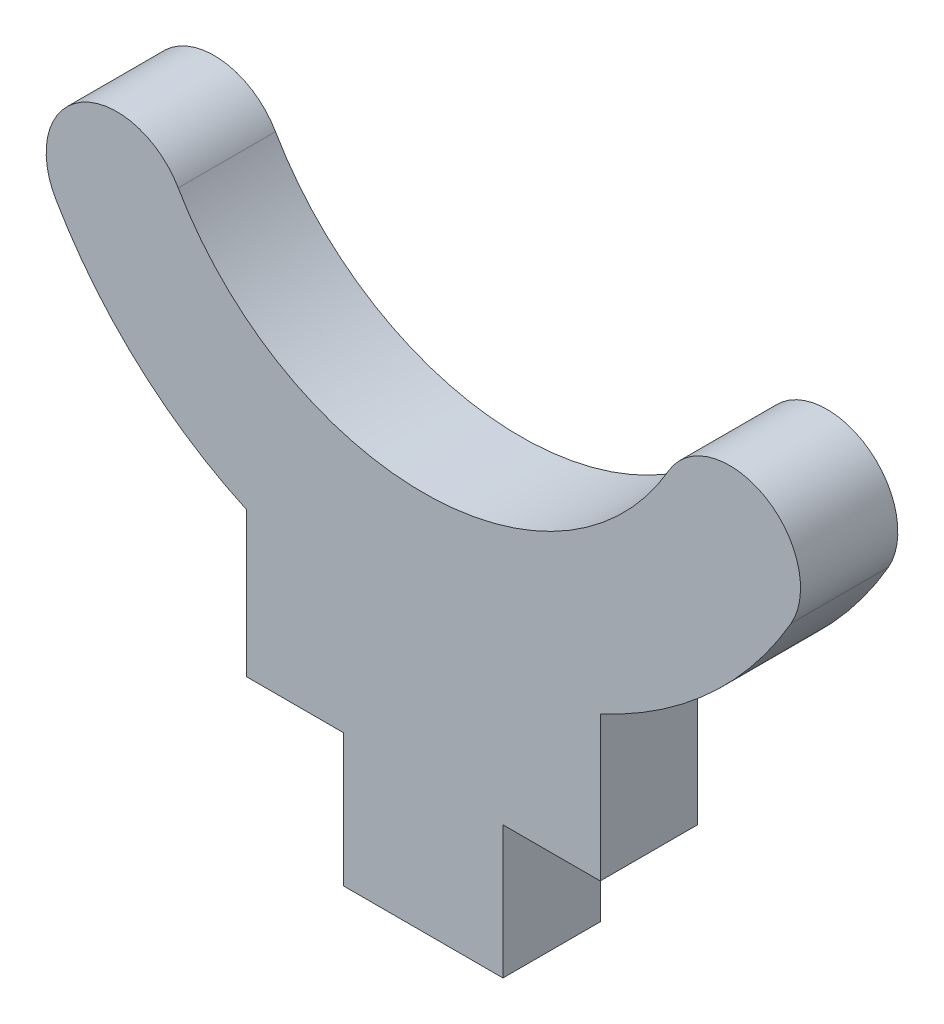
ISO-10303-21;
HEADER;
FILE_DESCRIPTION(('STEP AP214'),'2;1');
FILE_NAME('part.step','',(''),(''),'','','');
FILE_SCHEMA(('AUTOMOTIVE_DESIGN { 1 0 10303 214 1 1 1 1 }'));
ENDSEC;
DATA;
#1=APPLICATION_CONTEXT('core data for automotive mechanical design processes');
#2=APPLICATION_PROTOCOL_DEFINITION('international standard','automotive_design',2000,#1);
#3=PRODUCT_CONTEXT('',#1,'mechanical');
#4=PRODUCT('Part','Part','',(#3));
#5=PRODUCT_RELATED_PRODUCT_CATEGORY('part','',(#4));
#6=PRODUCT_DEFINITION_FORMATION('','',#4);
#7=PRODUCT_DEFINITION_CONTEXT('part definition',#1,'design');
#8=PRODUCT_DEFINITION('design','',#6,#7);
#9=PRODUCT_DEFINITION_SHAPE('','',#8);
#10=(LENGTH_UNIT() NAMED_UNIT(*) SI_UNIT(.MILLI.,.METRE.));
#11=(NAMED_UNIT(*) PLANE_ANGLE_UNIT() SI_UNIT($,.RADIAN.));
#12=(NAMED_UNIT(*) SI_UNIT($,.STERADIAN.) SOLID_ANGLE_UNIT());
#13=UNCERTAINTY_MEASURE_WITH_UNIT(LENGTH_MEASURE(1.E-05),#10,'distance_accuracy_value','');
#14=(GEOMETRIC_REPRESENTATION_CONTEXT(3) GLOBAL_UNCERTAINTY_ASSIGNED_CONTEXT((#13)) GLOBAL_UNIT_ASSIGNED_CONTEXT((#10,
#11,#12)) REPRESENTATION_CONTEXT('',''));
#15=CARTESIAN_POINT('',(0.,0.,0.));
#16=DIRECTION('',(0.,0.,1.));
#17=DIRECTION('',(1.,0.,0.));
#18=AXIS2_PLACEMENT_3D('',#15,#16,#17);
#19=CARTESIAN_POINT('',(-17.3205080756888,27.5,5.5));
#20=DIRECTION('',(0.,0.,-1.));
#21=DIRECTION('',(-1.,0.,0.));
#22=AXIS2_PLACEMENT_3D('',#19,#20,#21);
#23=CYLINDRICAL_SURFACE('',#22,4.);
#24=CARTESIAN_POINT('',(-17.3205080756888,27.5,0.));
#25=DIRECTION('',(0.,0.,1.));
#26=DIRECTION('',(-1.,0.,0.));
#27=AXIS2_PLACEMENT_3D('',#24,#25,#26);
#28=CIRCLE('',#27,4.);
#29=CARTESIAN_POINT('',(-13.856406460551,29.5,0.));
#30=VERTEX_POINT('',#29);
#31=CARTESIAN_POINT('',(-20.7846096908266,25.5,0.));
#32=VERTEX_POINT('',#31);
#33=EDGE_CURVE('E181',#30,#32,#28,.T.);
#34=ORIENTED_EDGE('',*,*,#33,.T.);
#35=DIRECTION('',(0.,0.,-1.));
#36=VECTOR('',#35,1.);
#37=CARTESIAN_POINT('',(-20.7846096908266,25.5,5.5));
#38=LINE('',#37,#36);
#39=CARTESIAN_POINT('',(-20.7846096908266,25.5,5.5));
#40=VERTEX_POINT('',#39);
#41=EDGE_CURVE('E11',#40,#32,#38,.T.);
#42=ORIENTED_EDGE('',*,*,#41,.F.);
#43=CARTESIAN_POINT('',(-17.3205080756888,27.5,5.5));
#44=DIRECTION('',(0.,0.,1.));
#45=DIRECTION('',(-1.,0.,0.));
#46=AXIS2_PLACEMENT_3D('',#43,#44,#45);
#47=CIRCLE('',#46,4.);
#48=CARTESIAN_POINT('',(-13.856406460551,29.5,5.5));
#49=VERTEX_POINT('',#48);
#50=EDGE_CURVE('E155',#49,#40,#47,.T.);
#51=ORIENTED_EDGE('',*,*,#50,.F.);
#52=DIRECTION('',(0.,0.,-1.));
#53=VECTOR('',#52,1.);
#54=CARTESIAN_POINT('',(-13.856406460551,29.5,5.5));
#55=LINE('',#54,#53);
#56=EDGE_CURVE('E156',#49,#30,#55,.T.);
#57=ORIENTED_EDGE('',*,*,#56,.T.);
#58=EDGE_LOOP('',(#34,#42,#51,#57));
#59=FACE_BOUND('',#58,.T.);
#60=ADVANCED_FACE('F33',(#59),#23,.T.);
#61=CARTESIAN_POINT('',(0.,37.5,5.5));
#62=DIRECTION('',(0.,0.,-1.));
#63=DIRECTION('',(-1.,0.,0.));
#64=AXIS2_PLACEMENT_3D('',#61,#62,#63);
#65=CYLINDRICAL_SURFACE('',#64,24.);
#66=CARTESIAN_POINT('',(0.,37.5,0.));
#67=DIRECTION('',(0.,0.,1.));
#68=DIRECTION('',(-1.,0.,0.));
#69=AXIS2_PLACEMENT_3D('',#66,#67,#68);
#70=CIRCLE('',#69,24.);
#71=CARTESIAN_POINT('',(-10.,15.6825757707286,0.));
#72=VERTEX_POINT('',#71);
#73=EDGE_CURVE('E179',#32,#72,#70,.T.);
#74=ORIENTED_EDGE('',*,*,#73,.T.);
#75=DIRECTION('',(0.,0.,-1.));
#76=VECTOR('',#75,1.);
#77=CARTESIAN_POINT('',(-10.,15.6825757707286,5.5));
#78=LINE('',#77,#76);
#79=CARTESIAN_POINT('',(-10.,15.6825757707286,5.5));
#80=VERTEX_POINT('',#79);
#81=EDGE_CURVE('E40',#80,#72,#78,.T.);
#82=ORIENTED_EDGE('',*,*,#81,.F.);
#83=CARTESIAN_POINT('',(0.,37.5,5.5));
#84=DIRECTION('',(0.,0.,1.));
#85=DIRECTION('',(-1.,0.,0.));
#86=AXIS2_PLACEMENT_3D('',#83,#84,#85);
#87=CIRCLE('',#86,24.);
#88=EDGE_CURVE('E197',#40,#80,#87,.T.);
#89=ORIENTED_EDGE('',*,*,#88,.F.);
#90=ORIENTED_EDGE('',*,*,#41,.T.);
#91=EDGE_LOOP('',(#74,#82,#89,#90));
#92=FACE_BOUND('',#91,.T.);
#93=ADVANCED_FACE('F245',(#92),#65,.T.);
#94=CARTESIAN_POINT('',(-10.,15.6825757707286,5.5));
#95=DIRECTION('',(1.,0.,0.));
#96=DIRECTION('',(0.,1.,0.));
#97=AXIS2_PLACEMENT_3D('',#94,#95,#96);
#98=PLANE('',#97);
#99=DIRECTION('',(0.,-1.,0.));
#100=VECTOR('',#99,1.);
#101=CARTESIAN_POINT('',(-10.,15.6825757707286,0.));
#102=LINE('',#101,#100);
#103=CARTESIAN_POINT('',(-10.,7.5,0.));
#104=VERTEX_POINT('',#103);
#105=EDGE_CURVE('E148',#72,#104,#102,.T.);
#106=ORIENTED_EDGE('',*,*,#105,.T.);
#107=DIRECTION('',(0.,0.,1.));
#108=VECTOR('',#107,1.);
#109=CARTESIAN_POINT('',(-10.,7.5,0.));
#110=LINE('',#109,#108);
#111=CARTESIAN_POINT('',(-10.,7.5,5.5));
#112=VERTEX_POINT('',#111);
#113=EDGE_CURVE('E205',#104,#112,#110,.T.);
#114=ORIENTED_EDGE('',*,*,#113,.T.);
#115=DIRECTION('',(0.,-1.,0.));
#116=VECTOR('',#115,1.);
#117=CARTESIAN_POINT('',(-10.,15.6825757707286,5.5));
#118=LINE('',#117,#116);
#119=EDGE_CURVE('E176',#80,#112,#118,.T.);
#120=ORIENTED_EDGE('',*,*,#119,.F.);
#121=ORIENTED_EDGE('',*,*,#81,.T.);
#122=EDGE_LOOP('',(#106,#114,#120,#121));
#123=FACE_BOUND('',#122,.T.);
#124=ADVANCED_FACE('F173',(#123),#98,.F.);
#125=CARTESIAN_POINT('',(-10.,0.,5.5));
#126=DIRECTION('',(0.,1.,0.));
#127=DIRECTION('',(0.,0.,1.));
#128=AXIS2_PLACEMENT_3D('',#125,#126,#127);
#129=PLANE('',#128);
#130=DIRECTION('',(1.,0.,0.));
#131=VECTOR('',#130,1.);
#132=CARTESIAN_POINT('',(-10.,0.,0.));
#133=LINE('',#132,#131);
#134=CARTESIAN_POINT('',(-4.5,0.,0.));
#135=VERTEX_POINT('',#134);
#136=CARTESIAN_POINT('',(4.5,0.,0.));
#137=VERTEX_POINT('',#136);
#138=EDGE_CURVE('E143',#135,#137,#133,.T.);
#139=ORIENTED_EDGE('',*,*,#138,.T.);
#140=DIRECTION('',(0.,0.,1.));
#141=VECTOR('',#140,1.);
#142=CARTESIAN_POINT('',(4.5,0.,0.));
#143=LINE('',#142,#141);
#144=CARTESIAN_POINT('',(4.5,0.,5.5));
#145=VERTEX_POINT('',#144);
#146=EDGE_CURVE('E186',#137,#145,#143,.T.);
#147=ORIENTED_EDGE('',*,*,#146,.T.);
#148=DIRECTION('',(1.,0.,0.));
#149=VECTOR('',#148,1.);
#150=CARTESIAN_POINT('',(-10.,0.,5.5));
#151=LINE('',#150,#149);
#152=CARTESIAN_POINT('',(-4.5,0.,5.5));
#153=VERTEX_POINT('',#152);
#154=EDGE_CURVE('E193',#153,#145,#151,.T.);
#155=ORIENTED_EDGE('',*,*,#154,.F.);
#156=DIRECTION('',(0.,0.,1.));
#157=VECTOR('',#156,1.);
#158=CARTESIAN_POINT('',(-4.5,0.,0.));
#159=LINE('',#158,#157);
#160=EDGE_CURVE('E201',#135,#153,#159,.T.);
#161=ORIENTED_EDGE('',*,*,#160,.F.);
#162=EDGE_LOOP('',(#139,#147,#155,#161));
#163=FACE_BOUND('',#162,.T.);
#164=ADVANCED_FACE('F224',(#163),#129,.F.);
#165=CARTESIAN_POINT('',(10.,0.,5.5));
#166=DIRECTION('',(-1.,0.,0.));
#167=DIRECTION('',(0.,-1.,0.));
#168=AXIS2_PLACEMENT_3D('',#165,#166,#167);
#169=PLANE('',#168);
#170=DIRECTION('',(0.,1.,0.));
#171=VECTOR('',#170,1.);
#172=CARTESIAN_POINT('',(10.,0.,5.5));
#173=LINE('',#172,#171);
#174=CARTESIAN_POINT('',(10.,7.5,5.5));
#175=VERTEX_POINT('',#174);
#176=CARTESIAN_POINT('',(10.,15.6825757707286,5.5));
#177=VERTEX_POINT('',#176);
#178=EDGE_CURVE('E137',#175,#177,#173,.T.);
#179=ORIENTED_EDGE('',*,*,#178,.F.);
#180=DIRECTION('',(0.,0.,1.));
#181=VECTOR('',#180,1.);
#182=CARTESIAN_POINT('',(10.,7.5,0.));
#183=LINE('',#182,#181);
#184=CARTESIAN_POINT('',(10.,7.5,0.));
#185=VERTEX_POINT('',#184);
#186=EDGE_CURVE('E124',#185,#175,#183,.T.);
#187=ORIENTED_EDGE('',*,*,#186,.F.);
#188=DIRECTION('',(0.,1.,0.));
#189=VECTOR('',#188,1.);
#190=CARTESIAN_POINT('',(10.,0.,0.));
#191=LINE('',#190,#189);
#192=CARTESIAN_POINT('',(10.,15.6825757707286,0.));
#193=VERTEX_POINT('',#192);
#194=EDGE_CURVE('E135',#185,#193,#191,.T.);
#195=ORIENTED_EDGE('',*,*,#194,.T.);
#196=DIRECTION('',(0.,0.,-1.));
#197=VECTOR('',#196,1.);
#198=CARTESIAN_POINT('',(10.,15.6825757707286,5.5));
#199=LINE('',#198,#197);
#200=EDGE_CURVE('E166',#177,#193,#199,.T.);
#201=ORIENTED_EDGE('',*,*,#200,.F.);
#202=EDGE_LOOP('',(#179,#187,#195,#201));
#203=FACE_BOUND('',#202,.T.);
#204=ADVANCED_FACE('F133',(#203),#169,.F.);
#205=CARTESIAN_POINT('',(0.,37.5,5.5));
#206=DIRECTION('',(0.,0.,-1.));
#207=DIRECTION('',(-1.,0.,0.));
#208=AXIS2_PLACEMENT_3D('',#205,#206,#207);
#209=CYLINDRICAL_SURFACE('',#208,24.);
#210=CARTESIAN_POINT('',(0.,37.5,0.));
#211=DIRECTION('',(0.,0.,1.));
#212=DIRECTION('',(-1.,0.,0.));
#213=AXIS2_PLACEMENT_3D('',#210,#211,#212);
#214=CIRCLE('',#213,24.);
#215=CARTESIAN_POINT('',(20.7846096908266,25.5000000000001,0.));
#216=VERTEX_POINT('',#215);
#217=EDGE_CURVE('E142',#193,#216,#214,.T.);
#218=ORIENTED_EDGE('',*,*,#217,.T.);
#219=DIRECTION('',(0.,0.,-1.));
#220=VECTOR('',#219,1.);
#221=CARTESIAN_POINT('',(20.7846096908266,25.5000000000001,5.5));
#222=LINE('',#221,#220);
#223=CARTESIAN_POINT('',(20.7846096908266,25.5000000000001,5.5));
#224=VERTEX_POINT('',#223);
#225=EDGE_CURVE('E163',#224,#216,#222,.T.);
#226=ORIENTED_EDGE('',*,*,#225,.F.);
#227=CARTESIAN_POINT('',(0.,37.5,5.5));
#228=DIRECTION('',(0.,0.,1.));
#229=DIRECTION('',(-1.,0.,0.));
#230=AXIS2_PLACEMENT_3D('',#227,#228,#229);
#231=CIRCLE('',#230,24.);
#232=EDGE_CURVE('E190',#177,#224,#231,.T.);
#233=ORIENTED_EDGE('',*,*,#232,.F.);
#234=ORIENTED_EDGE('',*,*,#200,.T.);
#235=EDGE_LOOP('',(#218,#226,#233,#234));
#236=FACE_BOUND('',#235,.T.);
#237=ADVANCED_FACE('F264',(#236),#209,.T.);
#238=CARTESIAN_POINT('',(17.3205080756888,27.5,5.5));
#239=DIRECTION('',(0.,0.,-1.));
#240=DIRECTION('',(-1.,0.,0.));
#241=AXIS2_PLACEMENT_3D('',#238,#239,#240);
#242=CYLINDRICAL_SURFACE('',#241,4.);
#243=CARTESIAN_POINT('',(17.3205080756888,27.5,0.));
#244=DIRECTION('',(0.,0.,1.));
#245=DIRECTION('',(-1.,0.,0.));
#246=AXIS2_PLACEMENT_3D('',#243,#244,#245);
#247=CIRCLE('',#246,4.);
#248=CARTESIAN_POINT('',(13.856406460551,29.5,0.));
#249=VERTEX_POINT('',#248);
#250=EDGE_CURVE('E145',#216,#249,#247,.T.);
#251=ORIENTED_EDGE('',*,*,#250,.T.);
#252=DIRECTION('',(0.,0.,-1.));
#253=VECTOR('',#252,1.);
#254=CARTESIAN_POINT('',(13.856406460551,29.5,5.5));
#255=LINE('',#254,#253);
#256=CARTESIAN_POINT('',(13.856406460551,29.5,5.5));
#257=VERTEX_POINT('',#256);
#258=EDGE_CURVE('E159',#257,#249,#255,.T.);
#259=ORIENTED_EDGE('',*,*,#258,.F.);
#260=CARTESIAN_POINT('',(17.3205080756888,27.5,5.5));
#261=DIRECTION('',(0.,0.,1.));
#262=DIRECTION('',(-1.,0.,0.));
#263=AXIS2_PLACEMENT_3D('',#260,#261,#262);
#264=CIRCLE('',#263,4.);
#265=EDGE_CURVE('E188',#224,#257,#264,.T.);
#266=ORIENTED_EDGE('',*,*,#265,.F.);
#267=ORIENTED_EDGE('',*,*,#225,.T.);
#268=EDGE_LOOP('',(#251,#259,#266,#267));
#269=FACE_BOUND('',#268,.T.);
#270=ADVANCED_FACE('F260',(#269),#242,.T.);
#271=CARTESIAN_POINT('',(0.,37.5,5.5));
#272=DIRECTION('',(0.,0.,-1.));
#273=DIRECTION('',(-1.,0.,0.));
#274=AXIS2_PLACEMENT_3D('',#271,#272,#273);
#275=CYLINDRICAL_SURFACE('',#274,16.);
#276=CARTESIAN_POINT('',(0.,37.5,0.));
#277=DIRECTION('',(0.,0.,-1.));
#278=DIRECTION('',(1.,0.,0.));
#279=AXIS2_PLACEMENT_3D('',#276,#277,#278);
#280=CIRCLE('',#279,16.);
#281=EDGE_CURVE('E153',#249,#30,#280,.T.);
#282=ORIENTED_EDGE('',*,*,#281,.T.);
#283=ORIENTED_EDGE('',*,*,#56,.F.);
#284=CARTESIAN_POINT('',(0.,37.5,5.5));
#285=DIRECTION('',(0.,0.,-1.));
#286=DIRECTION('',(1.,0.,0.));
#287=AXIS2_PLACEMENT_3D('',#284,#285,#286);
#288=CIRCLE('',#287,16.);
#289=EDGE_CURVE('E160',#257,#49,#288,.T.);
#290=ORIENTED_EDGE('',*,*,#289,.F.);
#291=ORIENTED_EDGE('',*,*,#258,.T.);
#292=EDGE_LOOP('',(#282,#283,#290,#291));
#293=FACE_BOUND('',#292,.T.);
#294=ADVANCED_FACE('F255',(#293),#275,.F.);
#295=CARTESIAN_POINT('',(-17.3205080756888,27.5,5.5));
#296=DIRECTION('',(0.,0.,-1.));
#297=DIRECTION('',(-1.,0.,0.));
#298=AXIS2_PLACEMENT_3D('',#295,#296,#297);
#299=PLANE('',#298);
#300=ORIENTED_EDGE('',*,*,#154,.T.);
#301=DIRECTION('',(0.,-1.,0.));
#302=VECTOR('',#301,1.);
#303=CARTESIAN_POINT('',(4.5,0.,5.5));
#304=LINE('',#303,#302);
#305=CARTESIAN_POINT('',(4.5,7.5,5.5));
#306=VERTEX_POINT('',#305);
#307=EDGE_CURVE('E129',#306,#145,#304,.T.);
#308=ORIENTED_EDGE('',*,*,#307,.F.);
#309=DIRECTION('',(-1.,0.,0.));
#310=VECTOR('',#309,1.);
#311=CARTESIAN_POINT('',(10.,7.5,5.5));
#312=LINE('',#311,#310);
#313=EDGE_CURVE('E207',#175,#306,#312,.T.);
#314=ORIENTED_EDGE('',*,*,#313,.F.);
#315=ORIENTED_EDGE('',*,*,#178,.T.);
#316=ORIENTED_EDGE('',*,*,#232,.T.);
#317=ORIENTED_EDGE('',*,*,#265,.T.);
#318=ORIENTED_EDGE('',*,*,#289,.T.);
#319=ORIENTED_EDGE('',*,*,#50,.T.);
#320=ORIENTED_EDGE('',*,*,#88,.T.);
#321=ORIENTED_EDGE('',*,*,#119,.T.);
#322=DIRECTION('',(-1.,0.,0.));
#323=VECTOR('',#322,1.);
#324=CARTESIAN_POINT('',(-10.,7.5,5.5));
#325=LINE('',#324,#323);
#326=CARTESIAN_POINT('',(-4.5,7.5,5.5));
#327=VERTEX_POINT('',#326);
#328=EDGE_CURVE('E208',#327,#112,#325,.T.);
#329=ORIENTED_EDGE('',*,*,#328,.F.);
#330=DIRECTION('',(0.,1.,0.));
#331=VECTOR('',#330,1.);
#332=CARTESIAN_POINT('',(-4.5,0.,5.5));
#333=LINE('',#332,#331);
#334=EDGE_CURVE('E211',#153,#327,#333,.T.);
#335=ORIENTED_EDGE('',*,*,#334,.F.);
#336=EDGE_LOOP('',(#300,#308,#314,#315,#316,#317,#318,#319,#320,#321,#329,#335));
#337=FACE_BOUND('',#336,.T.);
#338=ADVANCED_FACE('F231',(#337),#299,.F.);
#339=CARTESIAN_POINT('',(-17.3205080756888,27.5,0.));
#340=DIRECTION('',(0.,0.,-1.));
#341=DIRECTION('',(-1.,0.,0.));
#342=AXIS2_PLACEMENT_3D('',#339,#340,#341);
#343=PLANE('',#342);
#344=DIRECTION('',(0.,-1.,0.));
#345=VECTOR('',#344,1.);
#346=CARTESIAN_POINT('',(4.5,0.,0.));
#347=LINE('',#346,#345);
#348=CARTESIAN_POINT('',(4.5,7.5,0.));
#349=VERTEX_POINT('',#348);
#350=EDGE_CURVE('E47',#349,#137,#347,.T.);
#351=ORIENTED_EDGE('',*,*,#350,.T.);
#352=ORIENTED_EDGE('',*,*,#138,.F.);
#353=DIRECTION('',(0.,1.,0.));
#354=VECTOR('',#353,1.);
#355=CARTESIAN_POINT('',(-4.5,0.,0.));
#356=LINE('',#355,#354);
#357=CARTESIAN_POINT('',(-4.5,7.5,0.));
#358=VERTEX_POINT('',#357);
#359=EDGE_CURVE('E210',#135,#358,#356,.T.);
#360=ORIENTED_EDGE('',*,*,#359,.T.);
#361=DIRECTION('',(-1.,0.,0.));
#362=VECTOR('',#361,1.);
#363=CARTESIAN_POINT('',(-10.,7.5,0.));
#364=LINE('',#363,#362);
#365=EDGE_CURVE('E55',#358,#104,#364,.T.);
#366=ORIENTED_EDGE('',*,*,#365,.T.);
#367=ORIENTED_EDGE('',*,*,#105,.F.);
#368=ORIENTED_EDGE('',*,*,#73,.F.);
#369=ORIENTED_EDGE('',*,*,#33,.F.);
#370=ORIENTED_EDGE('',*,*,#281,.F.);
#371=ORIENTED_EDGE('',*,*,#250,.F.);
#372=ORIENTED_EDGE('',*,*,#217,.F.);
#373=ORIENTED_EDGE('',*,*,#194,.F.);
#374=DIRECTION('',(-1.,0.,0.));
#375=VECTOR('',#374,1.);
#376=CARTESIAN_POINT('',(10.,7.5,0.));
#377=LINE('',#376,#375);
#378=EDGE_CURVE('E120',#185,#349,#377,.T.);
#379=ORIENTED_EDGE('',*,*,#378,.T.);
#380=EDGE_LOOP('',(#351,#352,#360,#366,#367,#368,#369,#370,#371,#372,#373,#379));
#381=FACE_BOUND('',#380,.T.);
#382=ADVANCED_FACE('F140',(#381),#343,.T.);
#383=CARTESIAN_POINT('',(-10.,7.5,0.));
#384=DIRECTION('',(0.,1.,0.));
#385=DIRECTION('',(0.,0.,1.));
#386=AXIS2_PLACEMENT_3D('',#383,#384,#385);
#387=PLANE('',#386);
#388=ORIENTED_EDGE('',*,*,#328,.T.);
#389=ORIENTED_EDGE('',*,*,#113,.F.);
#390=ORIENTED_EDGE('',*,*,#365,.F.);
#391=DIRECTION('',(0.,0.,1.));
#392=VECTOR('',#391,1.);
#393=CARTESIAN_POINT('',(-4.5,7.5,0.));
#394=LINE('',#393,#392);
#395=EDGE_CURVE('E203',#358,#327,#394,.T.);
#396=ORIENTED_EDGE('',*,*,#395,.T.);
#397=EDGE_LOOP('',(#388,#389,#390,#396));
#398=FACE_BOUND('',#397,.T.);
#399=ADVANCED_FACE('F233',(#398),#387,.F.);
#400=CARTESIAN_POINT('',(-4.5,0.,0.));
#401=DIRECTION('',(1.,0.,0.));
#402=DIRECTION('',(0.,0.,-1.));
#403=AXIS2_PLACEMENT_3D('',#400,#401,#402);
#404=PLANE('',#403);
#405=ORIENTED_EDGE('',*,*,#334,.T.);
#406=ORIENTED_EDGE('',*,*,#395,.F.);
#407=ORIENTED_EDGE('',*,*,#359,.F.);
#408=ORIENTED_EDGE('',*,*,#160,.T.);
#409=EDGE_LOOP('',(#405,#406,#407,#408));
#410=FACE_BOUND('',#409,.T.);
#411=ADVANCED_FACE('F228',(#410),#404,.F.);
#412=CARTESIAN_POINT('',(4.5,0.,0.));
#413=DIRECTION('',(-1.,0.,0.));
#414=DIRECTION('',(0.,0.,1.));
#415=AXIS2_PLACEMENT_3D('',#412,#413,#414);
#416=PLANE('',#415);
#417=ORIENTED_EDGE('',*,*,#307,.T.);
#418=ORIENTED_EDGE('',*,*,#146,.F.);
#419=ORIENTED_EDGE('',*,*,#350,.F.);
#420=DIRECTION('',(0.,0.,1.));
#421=VECTOR('',#420,1.);
#422=CARTESIAN_POINT('',(4.5,7.5,0.));
#423=LINE('',#422,#421);
#424=EDGE_CURVE('E126',#349,#306,#423,.T.);
#425=ORIENTED_EDGE('',*,*,#424,.T.);
#426=EDGE_LOOP('',(#417,#418,#419,#425));
#427=FACE_BOUND('',#426,.T.);
#428=ADVANCED_FACE('F240',(#427),#416,.F.);
#429=CARTESIAN_POINT('',(10.,7.5,0.));
#430=DIRECTION('',(0.,1.,0.));
#431=DIRECTION('',(-1.,0.,0.));
#432=AXIS2_PLACEMENT_3D('',#429,#430,#431);
#433=PLANE('',#432);
#434=ORIENTED_EDGE('',*,*,#313,.T.);
#435=ORIENTED_EDGE('',*,*,#424,.F.);
#436=ORIENTED_EDGE('',*,*,#378,.F.);
#437=ORIENTED_EDGE('',*,*,#186,.T.);
#438=EDGE_LOOP('',(#434,#435,#436,#437));
#439=FACE_BOUND('',#438,.T.);
#440=ADVANCED_FACE('F123',(#439),#433,.F.);
#441=CLOSED_SHELL('',(#60,#93,#124,#164,#204,#237,#270,#294,#338,#382,#399,#411,#428,#440));
#442=MANIFOLD_SOLID_BREP('B2',#441);
#443=ADVANCED_BREP_SHAPE_REPRESENTATION('',(#18,#442),#14);
#444=SHAPE_DEFINITION_REPRESENTATION(#9,#443);
ENDSEC;
END-ISO-10303-21;
